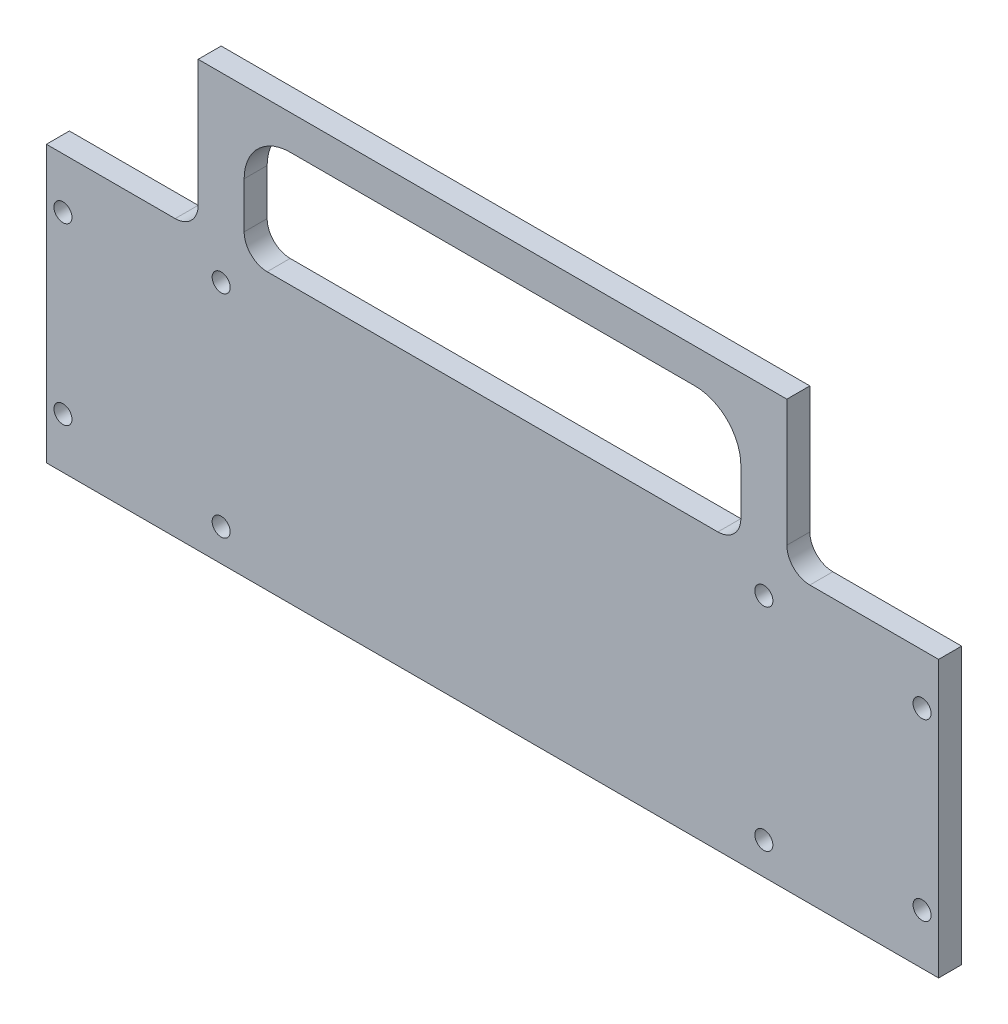
ISO-10303-21;
HEADER;
FILE_DESCRIPTION(('STEP AP214'),'2;1');
FILE_NAME('part.step','',(''),(''),'','','');
FILE_SCHEMA(('AUTOMOTIVE_DESIGN { 1 0 10303 214 1 1 1 1 }'));
ENDSEC;
DATA;
#1=APPLICATION_CONTEXT('core data for automotive mechanical design processes');
#2=APPLICATION_PROTOCOL_DEFINITION('international standard','automotive_design',2000,#1);
#3=PRODUCT_CONTEXT('',#1,'mechanical');
#4=PRODUCT('Part','Part','',(#3));
#5=PRODUCT_RELATED_PRODUCT_CATEGORY('part','',(#4));
#6=PRODUCT_DEFINITION_FORMATION('','',#4);
#7=PRODUCT_DEFINITION_CONTEXT('part definition',#1,'design');
#8=PRODUCT_DEFINITION('design','',#6,#7);
#9=PRODUCT_DEFINITION_SHAPE('','',#8);
#10=(LENGTH_UNIT() NAMED_UNIT(*) SI_UNIT(.MILLI.,.METRE.));
#11=(NAMED_UNIT(*) PLANE_ANGLE_UNIT() SI_UNIT($,.RADIAN.));
#12=(NAMED_UNIT(*) SI_UNIT($,.STERADIAN.) SOLID_ANGLE_UNIT());
#13=UNCERTAINTY_MEASURE_WITH_UNIT(LENGTH_MEASURE(1.E-05),#10,'distance_accuracy_value','');
#14=(GEOMETRIC_REPRESENTATION_CONTEXT(3) GLOBAL_UNCERTAINTY_ASSIGNED_CONTEXT((#13)) GLOBAL_UNIT_ASSIGNED_CONTEXT((#10,
#11,#12)) REPRESENTATION_CONTEXT('',''));
#15=CARTESIAN_POINT('',(0.,0.,0.));
#16=DIRECTION('',(0.,0.,1.));
#17=DIRECTION('',(1.,0.,0.));
#18=AXIS2_PLACEMENT_3D('',#15,#16,#17);
#19=CARTESIAN_POINT('',(-123.19,38.1,6.35));
#20=DIRECTION('',(0.,-1.,0.));
#21=DIRECTION('',(0.,0.,-1.));
#22=AXIS2_PLACEMENT_3D('',#19,#20,#21);
#23=PLANE('',#22);
#24=DIRECTION('',(-1.,0.,0.));
#25=VECTOR('',#24,1.);
#26=CARTESIAN_POINT('',(-123.19,38.1,6.35));
#27=LINE('',#26,#25);
#28=CARTESIAN_POINT('',(62.2299999999999,38.1,6.35));
#29=VERTEX_POINT('',#28);
#30=CARTESIAN_POINT('',(-62.23,38.1,6.35));
#31=VERTEX_POINT('',#30);
#32=EDGE_CURVE('E307',#29,#31,#27,.T.);
#33=ORIENTED_EDGE('',*,*,#32,.F.);
#34=DIRECTION('',(0.,0.,1.));
#35=VECTOR('',#34,1.);
#36=CARTESIAN_POINT('',(62.23,38.1,0.));
#37=LINE('',#36,#35);
#38=CARTESIAN_POINT('',(62.2299999999999,38.1,0.));
#39=VERTEX_POINT('',#38);
#40=EDGE_CURVE('E379',#29,#39,#37,.F.);
#41=ORIENTED_EDGE('',*,*,#40,.T.);
#42=DIRECTION('',(-1.,0.,0.));
#43=VECTOR('',#42,1.);
#44=CARTESIAN_POINT('',(-123.19,38.1,0.));
#45=LINE('',#44,#43);
#46=CARTESIAN_POINT('',(-62.23,38.1,0.));
#47=VERTEX_POINT('',#46);
#48=EDGE_CURVE('E323',#39,#47,#45,.T.);
#49=ORIENTED_EDGE('',*,*,#48,.T.);
#50=DIRECTION('',(0.,0.,1.));
#51=VECTOR('',#50,1.);
#52=CARTESIAN_POINT('',(-62.23,38.1,6.35));
#53=LINE('',#52,#51);
#54=EDGE_CURVE('E375',#47,#31,#53,.T.);
#55=ORIENTED_EDGE('',*,*,#54,.T.);
#56=EDGE_LOOP('',(#33,#41,#49,#55));
#57=FACE_BOUND('',#56,.T.);
#58=ADVANCED_FACE('F45',(#57),#23,.F.);
#59=CARTESIAN_POINT('',(-87.63,38.1,6.35));
#60=VERTEX_POINT('',#59);
#61=CARTESIAN_POINT('',(-123.19,38.1,6.35));
#62=VERTEX_POINT('',#61);
#63=EDGE_CURVE('E301',#60,#62,#27,.T.);
#64=ORIENTED_EDGE('',*,*,#63,.F.);
#65=DIRECTION('',(0.,0.,1.));
#66=VECTOR('',#65,1.);
#67=CARTESIAN_POINT('',(-87.63,38.1,0.));
#68=LINE('',#67,#66);
#69=CARTESIAN_POINT('',(-87.63,38.1,0.));
#70=VERTEX_POINT('',#69);
#71=EDGE_CURVE('E67',#60,#70,#68,.F.);
#72=ORIENTED_EDGE('',*,*,#71,.T.);
#73=CARTESIAN_POINT('',(-123.19,38.1,0.));
#74=VERTEX_POINT('',#73);
#75=EDGE_CURVE('E317',#70,#74,#45,.T.);
#76=ORIENTED_EDGE('',*,*,#75,.T.);
#77=DIRECTION('',(0.,0.,-1.));
#78=VECTOR('',#77,1.);
#79=CARTESIAN_POINT('',(-123.19,38.1,6.35));
#80=LINE('',#79,#78);
#81=EDGE_CURVE('E335',#62,#74,#80,.T.);
#82=ORIENTED_EDGE('',*,*,#81,.F.);
#83=EDGE_LOOP('',(#64,#72,#76,#82));
#84=FACE_BOUND('',#83,.T.);
#85=ADVANCED_FACE('F422',(#84),#23,.F.);
#86=CARTESIAN_POINT('',(123.19,38.1,6.35));
#87=DIRECTION('',(-1.,0.,0.));
#88=DIRECTION('',(0.,-1.,0.));
#89=AXIS2_PLACEMENT_3D('',#86,#87,#88);
#90=PLANE('',#89);
#91=DIRECTION('',(0.,1.,0.));
#92=VECTOR('',#91,1.);
#93=CARTESIAN_POINT('',(123.19,38.1,0.));
#94=LINE('',#93,#92);
#95=CARTESIAN_POINT('',(123.19,-38.1,0.));
#96=VERTEX_POINT('',#95);
#97=CARTESIAN_POINT('',(123.19,38.1,0.));
#98=VERTEX_POINT('',#97);
#99=EDGE_CURVE('E296',#96,#98,#94,.T.);
#100=ORIENTED_EDGE('',*,*,#99,.T.);
#101=DIRECTION('',(0.,0.,-1.));
#102=VECTOR('',#101,1.);
#103=CARTESIAN_POINT('',(123.19,38.1,6.35));
#104=LINE('',#103,#102);
#105=CARTESIAN_POINT('',(123.19,38.1,6.35));
#106=VERTEX_POINT('',#105);
#107=EDGE_CURVE('E339',#106,#98,#104,.T.);
#108=ORIENTED_EDGE('',*,*,#107,.F.);
#109=DIRECTION('',(0.,1.,0.));
#110=VECTOR('',#109,1.);
#111=CARTESIAN_POINT('',(123.19,38.1,6.35));
#112=LINE('',#111,#110);
#113=CARTESIAN_POINT('',(123.19,-38.1,6.35));
#114=VERTEX_POINT('',#113);
#115=EDGE_CURVE('E297',#114,#106,#112,.T.);
#116=ORIENTED_EDGE('',*,*,#115,.F.);
#117=DIRECTION('',(0.,0.,-1.));
#118=VECTOR('',#117,1.);
#119=CARTESIAN_POINT('',(123.19,-38.1,6.35));
#120=LINE('',#119,#118);
#121=EDGE_CURVE('E313',#114,#96,#120,.T.);
#122=ORIENTED_EDGE('',*,*,#121,.T.);
#123=EDGE_LOOP('',(#100,#108,#116,#122));
#124=FACE_BOUND('',#123,.T.);
#125=ADVANCED_FACE('F439',(#124),#90,.F.);
#126=CARTESIAN_POINT('',(87.6299999999999,38.1,0.));
#127=VERTEX_POINT('',#126);
#128=EDGE_CURVE('E318',#98,#127,#45,.T.);
#129=ORIENTED_EDGE('',*,*,#128,.T.);
#130=DIRECTION('',(0.,0.,1.));
#131=VECTOR('',#130,1.);
#132=CARTESIAN_POINT('',(87.63,38.1,6.35));
#133=LINE('',#132,#131);
#134=CARTESIAN_POINT('',(87.6299999999999,38.1,6.35));
#135=VERTEX_POINT('',#134);
#136=EDGE_CURVE('E397',#127,#135,#133,.T.);
#137=ORIENTED_EDGE('',*,*,#136,.T.);
#138=EDGE_CURVE('E303',#106,#135,#27,.T.);
#139=ORIENTED_EDGE('',*,*,#138,.F.);
#140=ORIENTED_EDGE('',*,*,#107,.T.);
#141=EDGE_LOOP('',(#129,#137,#139,#140));
#142=FACE_BOUND('',#141,.T.);
#143=ADVANCED_FACE('F462',(#142),#23,.F.);
#144=CARTESIAN_POINT('',(-123.19,38.1,6.35));
#145=DIRECTION('',(1.,0.,0.));
#146=DIRECTION('',(0.,1.,0.));
#147=AXIS2_PLACEMENT_3D('',#144,#145,#146);
#148=PLANE('',#147);
#149=DIRECTION('',(0.,-1.,0.));
#150=VECTOR('',#149,1.);
#151=CARTESIAN_POINT('',(-123.19,38.1,0.));
#152=LINE('',#151,#150);
#153=CARTESIAN_POINT('',(-123.19,-38.1,0.));
#154=VERTEX_POINT('',#153);
#155=EDGE_CURVE('E322',#74,#154,#152,.T.);
#156=ORIENTED_EDGE('',*,*,#155,.T.);
#157=DIRECTION('',(0.,0.,-1.));
#158=VECTOR('',#157,1.);
#159=CARTESIAN_POINT('',(-123.19,-38.1,6.35));
#160=LINE('',#159,#158);
#161=CARTESIAN_POINT('',(-123.19,-38.1,6.35));
#162=VERTEX_POINT('',#161);
#163=EDGE_CURVE('E331',#162,#154,#160,.T.);
#164=ORIENTED_EDGE('',*,*,#163,.F.);
#165=DIRECTION('',(0.,-1.,0.));
#166=VECTOR('',#165,1.);
#167=CARTESIAN_POINT('',(-123.19,38.1,6.35));
#168=LINE('',#167,#166);
#169=EDGE_CURVE('E306',#62,#162,#168,.T.);
#170=ORIENTED_EDGE('',*,*,#169,.F.);
#171=ORIENTED_EDGE('',*,*,#81,.T.);
#172=EDGE_LOOP('',(#156,#164,#170,#171));
#173=FACE_BOUND('',#172,.T.);
#174=ADVANCED_FACE('F428',(#173),#148,.F.);
#175=CARTESIAN_POINT('',(-123.19,-38.1,6.35));
#176=DIRECTION('',(0.,1.,0.));
#177=DIRECTION('',(0.,0.,1.));
#178=AXIS2_PLACEMENT_3D('',#175,#176,#177);
#179=PLANE('',#178);
#180=DIRECTION('',(1.,0.,0.));
#181=VECTOR('',#180,1.);
#182=CARTESIAN_POINT('',(-123.19,-38.1,0.));
#183=LINE('',#182,#181);
#184=EDGE_CURVE('E302',#154,#96,#183,.T.);
#185=ORIENTED_EDGE('',*,*,#184,.T.);
#186=ORIENTED_EDGE('',*,*,#121,.F.);
#187=DIRECTION('',(1.,0.,0.));
#188=VECTOR('',#187,1.);
#189=CARTESIAN_POINT('',(-123.19,-38.1,6.35));
#190=LINE('',#189,#188);
#191=EDGE_CURVE('E310',#162,#114,#190,.T.);
#192=ORIENTED_EDGE('',*,*,#191,.F.);
#193=ORIENTED_EDGE('',*,*,#163,.T.);
#194=EDGE_LOOP('',(#185,#186,#192,#193));
#195=FACE_BOUND('',#194,.T.);
#196=ADVANCED_FACE('F435',(#195),#179,.F.);
#197=CARTESIAN_POINT('',(0.,0.,6.35));
#198=DIRECTION('',(0.,0.,1.));
#199=DIRECTION('',(1.,0.,0.));
#200=AXIS2_PLACEMENT_3D('',#197,#198,#199);
#201=PLANE('',#200);
#202=ORIENTED_EDGE('',*,*,#138,.T.);
#203=CARTESIAN_POINT('',(87.63,44.45,6.35));
#204=DIRECTION('',(0.,0.,1.));
#205=DIRECTION('',(1.,0.,0.));
#206=AXIS2_PLACEMENT_3D('',#203,#204,#205);
#207=CIRCLE('',#206,6.35);
#208=CARTESIAN_POINT('',(81.28,44.45,6.35));
#209=VERTEX_POINT('',#208);
#210=EDGE_CURVE('E174',#135,#209,#207,.F.);
#211=ORIENTED_EDGE('',*,*,#210,.T.);
#212=DIRECTION('',(0.,1.,0.));
#213=VECTOR('',#212,1.);
#214=CARTESIAN_POINT('',(81.28,0.,6.35));
#215=LINE('',#214,#213);
#216=CARTESIAN_POINT('',(81.28,79.375,6.35));
#217=VERTEX_POINT('',#216);
#218=EDGE_CURVE('E168',#209,#217,#215,.T.);
#219=ORIENTED_EDGE('',*,*,#218,.T.);
#220=DIRECTION('',(1.,0.,0.));
#221=VECTOR('',#220,1.);
#222=CARTESIAN_POINT('',(0.,79.375,6.35));
#223=LINE('',#222,#221);
#224=CARTESIAN_POINT('',(-81.28,79.375,6.35));
#225=VERTEX_POINT('',#224);
#226=EDGE_CURVE('E173',#225,#217,#223,.T.);
#227=ORIENTED_EDGE('',*,*,#226,.F.);
#228=DIRECTION('',(0.,1.,0.));
#229=VECTOR('',#228,1.);
#230=CARTESIAN_POINT('',(-81.28,0.,6.35));
#231=LINE('',#230,#229);
#232=CARTESIAN_POINT('',(-81.28,44.45,6.35));
#233=VERTEX_POINT('',#232);
#234=EDGE_CURVE('E191',#233,#225,#231,.T.);
#235=ORIENTED_EDGE('',*,*,#234,.F.);
#236=CARTESIAN_POINT('',(-87.63,44.45,6.34999999999999));
#237=DIRECTION('',(0.,0.,1.));
#238=DIRECTION('',(1.,0.,0.));
#239=AXIS2_PLACEMENT_3D('',#236,#237,#238);
#240=CIRCLE('',#239,6.35);
#241=EDGE_CURVE('E54',#233,#60,#240,.F.);
#242=ORIENTED_EDGE('',*,*,#241,.T.);
#243=ORIENTED_EDGE('',*,*,#63,.T.);
#244=ORIENTED_EDGE('',*,*,#169,.T.);
#245=ORIENTED_EDGE('',*,*,#191,.T.);
#246=ORIENTED_EDGE('',*,*,#115,.T.);
#247=EDGE_LOOP('',(#202,#211,#219,#227,#235,#242,#243,#244,#245,#246));
#248=FACE_BOUND('',#247,.T.);
#249=CARTESIAN_POINT('',(-74.93,29.21,6.35));
#250=DIRECTION('',(0.,0.,1.));
#251=DIRECTION('',(1.,0.,0.));
#252=AXIS2_PLACEMENT_3D('',#249,#250,#251);
#253=CIRCLE('',#252,2.48919999999998);
#254=CARTESIAN_POINT('',(-72.4408,29.21,6.35));
#255=VERTEX_POINT('',#254);
#256=EDGE_CURVE('E232',#255,#255,#253,.T.);
#257=ORIENTED_EDGE('',*,*,#256,.F.);
#258=EDGE_LOOP('',(#257));
#259=FACE_BOUND('',#258,.T.);
#260=CARTESIAN_POINT('',(-74.93,-29.21,6.35));
#261=DIRECTION('',(0.,0.,1.));
#262=DIRECTION('',(1.,0.,0.));
#263=AXIS2_PLACEMENT_3D('',#260,#261,#262);
#264=CIRCLE('',#263,2.48919999999998);
#265=CARTESIAN_POINT('',(-72.4408,-29.21,6.35));
#266=VERTEX_POINT('',#265);
#267=EDGE_CURVE('E240',#266,#266,#264,.T.);
#268=ORIENTED_EDGE('',*,*,#267,.F.);
#269=EDGE_LOOP('',(#268));
#270=FACE_BOUND('',#269,.T.);
#271=CARTESIAN_POINT('',(74.93,29.21,6.35));
#272=DIRECTION('',(0.,0.,1.));
#273=DIRECTION('',(1.,0.,0.));
#274=AXIS2_PLACEMENT_3D('',#271,#272,#273);
#275=CIRCLE('',#274,2.48919999999998);
#276=CARTESIAN_POINT('',(77.4192,29.21,6.35));
#277=VERTEX_POINT('',#276);
#278=EDGE_CURVE('E248',#277,#277,#275,.T.);
#279=ORIENTED_EDGE('',*,*,#278,.F.);
#280=EDGE_LOOP('',(#279));
#281=FACE_BOUND('',#280,.T.);
#282=CARTESIAN_POINT('',(74.93,-29.21,6.35));
#283=DIRECTION('',(0.,0.,1.));
#284=DIRECTION('',(1.,0.,0.));
#285=AXIS2_PLACEMENT_3D('',#282,#283,#284);
#286=CIRCLE('',#285,2.48919999999998);
#287=CARTESIAN_POINT('',(77.4192,-29.21,6.35));
#288=VERTEX_POINT('',#287);
#289=EDGE_CURVE('E256',#288,#288,#286,.T.);
#290=ORIENTED_EDGE('',*,*,#289,.F.);
#291=EDGE_LOOP('',(#290));
#292=FACE_BOUND('',#291,.T.);
#293=CARTESIAN_POINT('',(-118.618,24.13,6.35));
#294=DIRECTION('',(0.,0.,1.));
#295=DIRECTION('',(1.,0.,0.));
#296=AXIS2_PLACEMENT_3D('',#293,#294,#295);
#297=CIRCLE('',#296,2.48919999999998);
#298=CARTESIAN_POINT('',(-116.1288,24.13,6.35));
#299=VERTEX_POINT('',#298);
#300=EDGE_CURVE('E264',#299,#299,#297,.T.);
#301=ORIENTED_EDGE('',*,*,#300,.F.);
#302=EDGE_LOOP('',(#301));
#303=FACE_BOUND('',#302,.T.);
#304=CARTESIAN_POINT('',(-118.618,-24.13,6.35));
#305=DIRECTION('',(0.,0.,1.));
#306=DIRECTION('',(1.,0.,0.));
#307=AXIS2_PLACEMENT_3D('',#304,#305,#306);
#308=CIRCLE('',#307,2.48919999999998);
#309=CARTESIAN_POINT('',(-116.1288,-24.13,6.35));
#310=VERTEX_POINT('',#309);
#311=EDGE_CURVE('E272',#310,#310,#308,.T.);
#312=ORIENTED_EDGE('',*,*,#311,.F.);
#313=EDGE_LOOP('',(#312));
#314=FACE_BOUND('',#313,.T.);
#315=CARTESIAN_POINT('',(118.618,24.13,6.35));
#316=DIRECTION('',(0.,0.,1.));
#317=DIRECTION('',(1.,0.,0.));
#318=AXIS2_PLACEMENT_3D('',#315,#316,#317);
#319=CIRCLE('',#318,2.48919999999998);
#320=CARTESIAN_POINT('',(121.1072,24.13,6.35));
#321=VERTEX_POINT('',#320);
#322=EDGE_CURVE('E280',#321,#321,#319,.T.);
#323=ORIENTED_EDGE('',*,*,#322,.F.);
#324=EDGE_LOOP('',(#323));
#325=FACE_BOUND('',#324,.T.);
#326=CARTESIAN_POINT('',(118.618,-24.13,6.35));
#327=DIRECTION('',(0.,0.,1.));
#328=DIRECTION('',(1.,0.,0.));
#329=AXIS2_PLACEMENT_3D('',#326,#327,#328);
#330=CIRCLE('',#329,2.48919999999998);
#331=CARTESIAN_POINT('',(121.1072,-24.13,6.35));
#332=VERTEX_POINT('',#331);
#333=EDGE_CURVE('E288',#332,#332,#330,.T.);
#334=ORIENTED_EDGE('',*,*,#333,.F.);
#335=EDGE_LOOP('',(#334));
#336=FACE_BOUND('',#335,.T.);
#337=DIRECTION('',(0.,1.,0.));
#338=VECTOR('',#337,1.);
#339=CARTESIAN_POINT('',(68.58,0.,6.35));
#340=LINE('',#339,#338);
#341=CARTESIAN_POINT('',(68.58,44.45,6.35));
#342=VERTEX_POINT('',#341);
#343=CARTESIAN_POINT('',(68.58,57.15,6.35));
#344=VERTEX_POINT('',#343);
#345=EDGE_CURVE('E179',#342,#344,#340,.T.);
#346=ORIENTED_EDGE('',*,*,#345,.F.);
#347=CARTESIAN_POINT('',(62.23,44.45,6.34999999999999));
#348=DIRECTION('',(0.,0.,1.));
#349=DIRECTION('',(1.,0.,0.));
#350=AXIS2_PLACEMENT_3D('',#347,#348,#349);
#351=CIRCLE('',#350,6.35);
#352=EDGE_CURVE('E385',#342,#29,#351,.F.);
#353=ORIENTED_EDGE('',*,*,#352,.T.);
#354=ORIENTED_EDGE('',*,*,#32,.T.);
#355=CARTESIAN_POINT('',(-62.23,44.45,6.35));
#356=DIRECTION('',(0.,0.,1.));
#357=DIRECTION('',(1.,0.,0.));
#358=AXIS2_PLACEMENT_3D('',#355,#356,#357);
#359=CIRCLE('',#358,6.35);
#360=CARTESIAN_POINT('',(-68.58,44.45,6.35));
#361=VERTEX_POINT('',#360);
#362=EDGE_CURVE('E391',#31,#361,#359,.F.);
#363=ORIENTED_EDGE('',*,*,#362,.T.);
#364=DIRECTION('',(0.,1.,0.));
#365=VECTOR('',#364,1.);
#366=CARTESIAN_POINT('',(-68.58,0.,6.35));
#367=LINE('',#366,#365);
#368=CARTESIAN_POINT('',(-68.58,57.15,6.35));
#369=VERTEX_POINT('',#368);
#370=EDGE_CURVE('E208',#361,#369,#367,.T.);
#371=ORIENTED_EDGE('',*,*,#370,.T.);
#372=CARTESIAN_POINT('',(-55.88,57.15,6.34999999999999));
#373=DIRECTION('',(0.,0.,1.));
#374=DIRECTION('',(1.,0.,0.));
#375=AXIS2_PLACEMENT_3D('',#372,#373,#374);
#376=CIRCLE('',#375,12.7);
#377=CARTESIAN_POINT('',(-55.88,69.85,6.35));
#378=VERTEX_POINT('',#377);
#379=EDGE_CURVE('E351',#369,#378,#376,.F.);
#380=ORIENTED_EDGE('',*,*,#379,.T.);
#381=DIRECTION('',(1.,0.,0.));
#382=VECTOR('',#381,1.);
#383=CARTESIAN_POINT('',(0.,69.85,6.35));
#384=LINE('',#383,#382);
#385=CARTESIAN_POINT('',(55.88,69.85,6.35));
#386=VERTEX_POINT('',#385);
#387=EDGE_CURVE('E192',#378,#386,#384,.T.);
#388=ORIENTED_EDGE('',*,*,#387,.T.);
#389=CARTESIAN_POINT('',(55.88,57.15,6.34999999999999));
#390=DIRECTION('',(0.,0.,1.));
#391=DIRECTION('',(1.,0.,0.));
#392=AXIS2_PLACEMENT_3D('',#389,#390,#391);
#393=CIRCLE('',#392,12.7);
#394=EDGE_CURVE('E364',#386,#344,#393,.F.);
#395=ORIENTED_EDGE('',*,*,#394,.T.);
#396=EDGE_LOOP('',(#346,#353,#354,#363,#371,#380,#388,#395));
#397=FACE_BOUND('',#396,.T.);
#398=ADVANCED_FACE('F171',(#248,#259,#270,#281,#292,#303,#314,#325,#336,#397),#201,.T.);
#399=CARTESIAN_POINT('',(0.,0.,0.));
#400=DIRECTION('',(0.,0.,1.));
#401=DIRECTION('',(1.,0.,0.));
#402=AXIS2_PLACEMENT_3D('',#399,#400,#401);
#403=PLANE('',#402);
#404=ORIENTED_EDGE('',*,*,#48,.F.);
#405=CARTESIAN_POINT('',(62.23,44.45,0.));
#406=DIRECTION('',(0.,0.,1.));
#407=DIRECTION('',(1.,0.,0.));
#408=AXIS2_PLACEMENT_3D('',#405,#406,#407);
#409=CIRCLE('',#408,6.35);
#410=CARTESIAN_POINT('',(68.58,44.45,0.));
#411=VERTEX_POINT('',#410);
#412=EDGE_CURVE('E388',#39,#411,#409,.T.);
#413=ORIENTED_EDGE('',*,*,#412,.T.);
#414=DIRECTION('',(0.,-1.,0.));
#415=VECTOR('',#414,1.);
#416=CARTESIAN_POINT('',(68.58,0.,0.));
#417=LINE('',#416,#415);
#418=CARTESIAN_POINT('',(68.58,57.15,0.));
#419=VERTEX_POINT('',#418);
#420=EDGE_CURVE('E198',#419,#411,#417,.T.);
#421=ORIENTED_EDGE('',*,*,#420,.F.);
#422=CARTESIAN_POINT('',(55.88,57.15,0.));
#423=DIRECTION('',(0.,0.,1.));
#424=DIRECTION('',(1.,0.,0.));
#425=AXIS2_PLACEMENT_3D('',#422,#423,#424);
#426=CIRCLE('',#425,12.7);
#427=CARTESIAN_POINT('',(55.88,69.85,0.));
#428=VERTEX_POINT('',#427);
#429=EDGE_CURVE('E368',#419,#428,#426,.T.);
#430=ORIENTED_EDGE('',*,*,#429,.T.);
#431=DIRECTION('',(-1.,0.,0.));
#432=VECTOR('',#431,1.);
#433=CARTESIAN_POINT('',(0.,69.85,0.));
#434=LINE('',#433,#432);
#435=CARTESIAN_POINT('',(-55.88,69.85,0.));
#436=VERTEX_POINT('',#435);
#437=EDGE_CURVE('E209',#428,#436,#434,.T.);
#438=ORIENTED_EDGE('',*,*,#437,.T.);
#439=CARTESIAN_POINT('',(-55.88,57.15,0.));
#440=DIRECTION('',(0.,0.,1.));
#441=DIRECTION('',(1.,0.,0.));
#442=AXIS2_PLACEMENT_3D('',#439,#440,#441);
#443=CIRCLE('',#442,12.7);
#444=CARTESIAN_POINT('',(-68.58,57.15,0.));
#445=VERTEX_POINT('',#444);
#446=EDGE_CURVE('E354',#436,#445,#443,.T.);
#447=ORIENTED_EDGE('',*,*,#446,.T.);
#448=DIRECTION('',(0.,-1.,0.));
#449=VECTOR('',#448,1.);
#450=CARTESIAN_POINT('',(-68.58,0.,0.));
#451=LINE('',#450,#449);
#452=CARTESIAN_POINT('',(-68.58,44.45,0.));
#453=VERTEX_POINT('',#452);
#454=EDGE_CURVE('E219',#445,#453,#451,.T.);
#455=ORIENTED_EDGE('',*,*,#454,.T.);
#456=CARTESIAN_POINT('',(-62.23,44.45,0.));
#457=DIRECTION('',(0.,0.,1.));
#458=DIRECTION('',(1.,0.,0.));
#459=AXIS2_PLACEMENT_3D('',#456,#457,#458);
#460=CIRCLE('',#459,6.35);
#461=EDGE_CURVE('E394',#453,#47,#460,.T.);
#462=ORIENTED_EDGE('',*,*,#461,.T.);
#463=EDGE_LOOP('',(#404,#413,#421,#430,#438,#447,#455,#462));
#464=FACE_BOUND('',#463,.T.);
#465=CARTESIAN_POINT('',(-74.93,29.21,0.));
#466=DIRECTION('',(0.,0.,1.));
#467=DIRECTION('',(1.,0.,0.));
#468=AXIS2_PLACEMENT_3D('',#465,#466,#467);
#469=CIRCLE('',#468,2.4892);
#470=CARTESIAN_POINT('',(-72.4408,29.21,0.));
#471=VERTEX_POINT('',#470);
#472=EDGE_CURVE('E236',#471,#471,#469,.T.);
#473=ORIENTED_EDGE('',*,*,#472,.T.);
#474=EDGE_LOOP('',(#473));
#475=FACE_BOUND('',#474,.T.);
#476=CARTESIAN_POINT('',(-74.93,-29.21,0.));
#477=DIRECTION('',(0.,0.,1.));
#478=DIRECTION('',(1.,0.,0.));
#479=AXIS2_PLACEMENT_3D('',#476,#477,#478);
#480=CIRCLE('',#479,2.4892);
#481=CARTESIAN_POINT('',(-72.4408,-29.21,0.));
#482=VERTEX_POINT('',#481);
#483=EDGE_CURVE('E244',#482,#482,#480,.T.);
#484=ORIENTED_EDGE('',*,*,#483,.T.);
#485=EDGE_LOOP('',(#484));
#486=FACE_BOUND('',#485,.T.);
#487=CARTESIAN_POINT('',(74.93,29.21,0.));
#488=DIRECTION('',(0.,0.,1.));
#489=DIRECTION('',(1.,0.,0.));
#490=AXIS2_PLACEMENT_3D('',#487,#488,#489);
#491=CIRCLE('',#490,2.4892);
#492=CARTESIAN_POINT('',(77.4192,29.21,0.));
#493=VERTEX_POINT('',#492);
#494=EDGE_CURVE('E252',#493,#493,#491,.T.);
#495=ORIENTED_EDGE('',*,*,#494,.T.);
#496=EDGE_LOOP('',(#495));
#497=FACE_BOUND('',#496,.T.);
#498=CARTESIAN_POINT('',(74.93,-29.21,0.));
#499=DIRECTION('',(0.,0.,1.));
#500=DIRECTION('',(1.,0.,0.));
#501=AXIS2_PLACEMENT_3D('',#498,#499,#500);
#502=CIRCLE('',#501,2.4892);
#503=CARTESIAN_POINT('',(77.4192,-29.21,0.));
#504=VERTEX_POINT('',#503);
#505=EDGE_CURVE('E260',#504,#504,#502,.T.);
#506=ORIENTED_EDGE('',*,*,#505,.T.);
#507=EDGE_LOOP('',(#506));
#508=FACE_BOUND('',#507,.T.);
#509=CARTESIAN_POINT('',(-118.618,24.13,0.));
#510=DIRECTION('',(0.,0.,1.));
#511=DIRECTION('',(1.,0.,0.));
#512=AXIS2_PLACEMENT_3D('',#509,#510,#511);
#513=CIRCLE('',#512,2.4892);
#514=CARTESIAN_POINT('',(-116.1288,24.13,0.));
#515=VERTEX_POINT('',#514);
#516=EDGE_CURVE('E268',#515,#515,#513,.T.);
#517=ORIENTED_EDGE('',*,*,#516,.T.);
#518=EDGE_LOOP('',(#517));
#519=FACE_BOUND('',#518,.T.);
#520=CARTESIAN_POINT('',(-118.618,-24.13,0.));
#521=DIRECTION('',(0.,0.,1.));
#522=DIRECTION('',(1.,0.,0.));
#523=AXIS2_PLACEMENT_3D('',#520,#521,#522);
#524=CIRCLE('',#523,2.4892);
#525=CARTESIAN_POINT('',(-116.1288,-24.13,0.));
#526=VERTEX_POINT('',#525);
#527=EDGE_CURVE('E276',#526,#526,#524,.T.);
#528=ORIENTED_EDGE('',*,*,#527,.T.);
#529=EDGE_LOOP('',(#528));
#530=FACE_BOUND('',#529,.T.);
#531=CARTESIAN_POINT('',(118.618,24.13,0.));
#532=DIRECTION('',(0.,0.,1.));
#533=DIRECTION('',(1.,0.,0.));
#534=AXIS2_PLACEMENT_3D('',#531,#532,#533);
#535=CIRCLE('',#534,2.4892);
#536=CARTESIAN_POINT('',(121.1072,24.13,0.));
#537=VERTEX_POINT('',#536);
#538=EDGE_CURVE('E284',#537,#537,#535,.T.);
#539=ORIENTED_EDGE('',*,*,#538,.T.);
#540=EDGE_LOOP('',(#539));
#541=FACE_BOUND('',#540,.T.);
#542=CARTESIAN_POINT('',(118.618,-24.13,0.));
#543=DIRECTION('',(0.,0.,1.));
#544=DIRECTION('',(1.,0.,0.));
#545=AXIS2_PLACEMENT_3D('',#542,#543,#544);
#546=CIRCLE('',#545,2.4892);
#547=CARTESIAN_POINT('',(121.1072,-24.13,0.));
#548=VERTEX_POINT('',#547);
#549=EDGE_CURVE('E292',#548,#548,#546,.T.);
#550=ORIENTED_EDGE('',*,*,#549,.T.);
#551=EDGE_LOOP('',(#550));
#552=FACE_BOUND('',#551,.T.);
#553=ORIENTED_EDGE('',*,*,#99,.F.);
#554=ORIENTED_EDGE('',*,*,#184,.F.);
#555=ORIENTED_EDGE('',*,*,#155,.F.);
#556=ORIENTED_EDGE('',*,*,#75,.F.);
#557=CARTESIAN_POINT('',(-87.63,44.45,0.));
#558=DIRECTION('',(0.,0.,1.));
#559=DIRECTION('',(1.,0.,0.));
#560=AXIS2_PLACEMENT_3D('',#557,#558,#559);
#561=CIRCLE('',#560,6.35);
#562=CARTESIAN_POINT('',(-81.28,44.45,0.));
#563=VERTEX_POINT('',#562);
#564=EDGE_CURVE('E11',#70,#563,#561,.T.);
#565=ORIENTED_EDGE('',*,*,#564,.T.);
#566=DIRECTION('',(0.,-1.,0.));
#567=VECTOR('',#566,1.);
#568=CARTESIAN_POINT('',(-81.28,0.,0.));
#569=LINE('',#568,#567);
#570=CARTESIAN_POINT('',(-81.28,79.375,0.));
#571=VERTEX_POINT('',#570);
#572=EDGE_CURVE('E215',#571,#563,#569,.T.);
#573=ORIENTED_EDGE('',*,*,#572,.F.);
#574=DIRECTION('',(-1.,0.,0.));
#575=VECTOR('',#574,1.);
#576=CARTESIAN_POINT('',(0.,79.375,0.));
#577=LINE('',#576,#575);
#578=CARTESIAN_POINT('',(81.28,79.375,0.));
#579=VERTEX_POINT('',#578);
#580=EDGE_CURVE('E212',#579,#571,#577,.T.);
#581=ORIENTED_EDGE('',*,*,#580,.F.);
#582=DIRECTION('',(0.,-1.,0.));
#583=VECTOR('',#582,1.);
#584=CARTESIAN_POINT('',(81.28,0.,0.));
#585=LINE('',#584,#583);
#586=CARTESIAN_POINT('',(81.28,44.45,0.));
#587=VERTEX_POINT('',#586);
#588=EDGE_CURVE('E196',#579,#587,#585,.T.);
#589=ORIENTED_EDGE('',*,*,#588,.T.);
#590=CARTESIAN_POINT('',(87.63,44.45,0.));
#591=DIRECTION('',(0.,0.,1.));
#592=DIRECTION('',(1.,0.,0.));
#593=AXIS2_PLACEMENT_3D('',#590,#591,#592);
#594=CIRCLE('',#593,6.35);
#595=EDGE_CURVE('E412',#587,#127,#594,.T.);
#596=ORIENTED_EDGE('',*,*,#595,.T.);
#597=ORIENTED_EDGE('',*,*,#128,.F.);
#598=EDGE_LOOP('',(#553,#554,#555,#556,#565,#573,#581,#589,#596,#597));
#599=FACE_BOUND('',#598,.T.);
#600=ADVANCED_FACE('F432',(#464,#475,#486,#497,#508,#519,#530,#541,#552,#599),#403,.F.);
#601=CARTESIAN_POINT('',(118.618,-24.13,6.35));
#602=DIRECTION('',(0.,0.,1.));
#603=DIRECTION('',(1.,0.,0.));
#604=AXIS2_PLACEMENT_3D('',#601,#602,#603);
#605=CYLINDRICAL_SURFACE('',#604,2.48919999999999);
#606=ORIENTED_EDGE('',*,*,#549,.F.);
#607=EDGE_LOOP('',(#606));
#608=FACE_BOUND('',#607,.T.);
#609=ORIENTED_EDGE('',*,*,#333,.T.);
#610=EDGE_LOOP('',(#609));
#611=FACE_BOUND('',#610,.T.);
#612=ADVANCED_FACE('F539',(#608,#611),#605,.F.);
#613=CARTESIAN_POINT('',(118.618,24.13,6.35));
#614=DIRECTION('',(0.,0.,1.));
#615=DIRECTION('',(1.,0.,0.));
#616=AXIS2_PLACEMENT_3D('',#613,#614,#615);
#617=CYLINDRICAL_SURFACE('',#616,2.48919999999999);
#618=ORIENTED_EDGE('',*,*,#538,.F.);
#619=EDGE_LOOP('',(#618));
#620=FACE_BOUND('',#619,.T.);
#621=ORIENTED_EDGE('',*,*,#322,.T.);
#622=EDGE_LOOP('',(#621));
#623=FACE_BOUND('',#622,.T.);
#624=ADVANCED_FACE('F546',(#620,#623),#617,.F.);
#625=CARTESIAN_POINT('',(-118.618,-24.13,6.35));
#626=DIRECTION('',(0.,0.,1.));
#627=DIRECTION('',(1.,0.,0.));
#628=AXIS2_PLACEMENT_3D('',#625,#626,#627);
#629=CYLINDRICAL_SURFACE('',#628,2.48919999999999);
#630=ORIENTED_EDGE('',*,*,#527,.F.);
#631=EDGE_LOOP('',(#630));
#632=FACE_BOUND('',#631,.T.);
#633=ORIENTED_EDGE('',*,*,#311,.T.);
#634=EDGE_LOOP('',(#633));
#635=FACE_BOUND('',#634,.T.);
#636=ADVANCED_FACE('F550',(#632,#635),#629,.F.);
#637=CARTESIAN_POINT('',(-118.618,24.13,6.35));
#638=DIRECTION('',(0.,0.,1.));
#639=DIRECTION('',(1.,0.,0.));
#640=AXIS2_PLACEMENT_3D('',#637,#638,#639);
#641=CYLINDRICAL_SURFACE('',#640,2.48919999999999);
#642=ORIENTED_EDGE('',*,*,#516,.F.);
#643=EDGE_LOOP('',(#642));
#644=FACE_BOUND('',#643,.T.);
#645=ORIENTED_EDGE('',*,*,#300,.T.);
#646=EDGE_LOOP('',(#645));
#647=FACE_BOUND('',#646,.T.);
#648=ADVANCED_FACE('F554',(#644,#647),#641,.F.);
#649=CARTESIAN_POINT('',(74.93,-29.21,6.35));
#650=DIRECTION('',(0.,0.,1.));
#651=DIRECTION('',(1.,0.,0.));
#652=AXIS2_PLACEMENT_3D('',#649,#650,#651);
#653=CYLINDRICAL_SURFACE('',#652,2.48919999999999);
#654=ORIENTED_EDGE('',*,*,#505,.F.);
#655=EDGE_LOOP('',(#654));
#656=FACE_BOUND('',#655,.T.);
#657=ORIENTED_EDGE('',*,*,#289,.T.);
#658=EDGE_LOOP('',(#657));
#659=FACE_BOUND('',#658,.T.);
#660=ADVANCED_FACE('F558',(#656,#659),#653,.F.);
#661=CARTESIAN_POINT('',(74.93,29.21,6.35));
#662=DIRECTION('',(0.,0.,1.));
#663=DIRECTION('',(1.,0.,0.));
#664=AXIS2_PLACEMENT_3D('',#661,#662,#663);
#665=CYLINDRICAL_SURFACE('',#664,2.48919999999999);
#666=ORIENTED_EDGE('',*,*,#494,.F.);
#667=EDGE_LOOP('',(#666));
#668=FACE_BOUND('',#667,.T.);
#669=ORIENTED_EDGE('',*,*,#278,.T.);
#670=EDGE_LOOP('',(#669));
#671=FACE_BOUND('',#670,.T.);
#672=ADVANCED_FACE('F562',(#668,#671),#665,.F.);
#673=CARTESIAN_POINT('',(-74.93,-29.21,6.35));
#674=DIRECTION('',(0.,0.,1.));
#675=DIRECTION('',(1.,0.,0.));
#676=AXIS2_PLACEMENT_3D('',#673,#674,#675);
#677=CYLINDRICAL_SURFACE('',#676,2.48919999999999);
#678=ORIENTED_EDGE('',*,*,#483,.F.);
#679=EDGE_LOOP('',(#678));
#680=FACE_BOUND('',#679,.T.);
#681=ORIENTED_EDGE('',*,*,#267,.T.);
#682=EDGE_LOOP('',(#681));
#683=FACE_BOUND('',#682,.T.);
#684=ADVANCED_FACE('F455',(#680,#683),#677,.F.);
#685=CARTESIAN_POINT('',(-74.93,29.21,6.35));
#686=DIRECTION('',(0.,0.,1.));
#687=DIRECTION('',(1.,0.,0.));
#688=AXIS2_PLACEMENT_3D('',#685,#686,#687);
#689=CYLINDRICAL_SURFACE('',#688,2.48919999999999);
#690=ORIENTED_EDGE('',*,*,#472,.F.);
#691=EDGE_LOOP('',(#690));
#692=FACE_BOUND('',#691,.T.);
#693=ORIENTED_EDGE('',*,*,#256,.T.);
#694=EDGE_LOOP('',(#693));
#695=FACE_BOUND('',#694,.T.);
#696=ADVANCED_FACE('F446',(#692,#695),#689,.F.);
#697=CARTESIAN_POINT('',(-81.28,0.,-91.1595525713021));
#698=DIRECTION('',(1.,0.,0.));
#699=DIRECTION('',(0.,1.,0.));
#700=AXIS2_PLACEMENT_3D('',#697,#698,#699);
#701=PLANE('',#700);
#702=ORIENTED_EDGE('',*,*,#572,.T.);
#703=DIRECTION('',(0.,0.,1.));
#704=VECTOR('',#703,1.);
#705=CARTESIAN_POINT('',(-81.28,44.45,6.34999999999999));
#706=LINE('',#705,#704);
#707=EDGE_CURVE('E404',#563,#233,#706,.T.);
#708=ORIENTED_EDGE('',*,*,#707,.T.);
#709=ORIENTED_EDGE('',*,*,#234,.T.);
#710=DIRECTION('',(0.,0.,1.));
#711=VECTOR('',#710,1.);
#712=CARTESIAN_POINT('',(-81.28,79.375,-91.1595525713021));
#713=LINE('',#712,#711);
#714=EDGE_CURVE('E189',#571,#225,#713,.T.);
#715=ORIENTED_EDGE('',*,*,#714,.F.);
#716=EDGE_LOOP('',(#702,#708,#709,#715));
#717=FACE_BOUND('',#716,.T.);
#718=ADVANCED_FACE('F444',(#717),#701,.F.);
#719=CARTESIAN_POINT('',(0.,79.375,-91.1595525713021));
#720=DIRECTION('',(0.,-1.,0.));
#721=DIRECTION('',(0.,0.,-1.));
#722=AXIS2_PLACEMENT_3D('',#719,#720,#721);
#723=PLANE('',#722);
#724=ORIENTED_EDGE('',*,*,#226,.T.);
#725=DIRECTION('',(0.,0.,1.));
#726=VECTOR('',#725,1.);
#727=CARTESIAN_POINT('',(81.28,79.375,-91.1595525713021));
#728=LINE('',#727,#726);
#729=EDGE_CURVE('E186',#579,#217,#728,.T.);
#730=ORIENTED_EDGE('',*,*,#729,.F.);
#731=ORIENTED_EDGE('',*,*,#580,.T.);
#732=ORIENTED_EDGE('',*,*,#714,.T.);
#733=EDGE_LOOP('',(#724,#730,#731,#732));
#734=FACE_BOUND('',#733,.T.);
#735=ADVANCED_FACE('F184',(#734),#723,.F.);
#736=CARTESIAN_POINT('',(0.,69.85,-91.1595525713021));
#737=DIRECTION('',(0.,-1.,0.));
#738=DIRECTION('',(0.,0.,-1.));
#739=AXIS2_PLACEMENT_3D('',#736,#737,#738);
#740=PLANE('',#739);
#741=ORIENTED_EDGE('',*,*,#437,.F.);
#742=DIRECTION('',(0.,0.,1.));
#743=VECTOR('',#742,1.);
#744=CARTESIAN_POINT('',(55.88,69.85,-91.1595525713021));
#745=LINE('',#744,#743);
#746=EDGE_CURVE('E357',#428,#386,#745,.T.);
#747=ORIENTED_EDGE('',*,*,#746,.T.);
#748=ORIENTED_EDGE('',*,*,#387,.F.);
#749=DIRECTION('',(0.,0.,1.));
#750=VECTOR('',#749,1.);
#751=CARTESIAN_POINT('',(-55.88,69.85,0.));
#752=LINE('',#751,#750);
#753=EDGE_CURVE('E347',#378,#436,#752,.F.);
#754=ORIENTED_EDGE('',*,*,#753,.T.);
#755=EDGE_LOOP('',(#741,#747,#748,#754));
#756=FACE_BOUND('',#755,.T.);
#757=ADVANCED_FACE('F452',(#756),#740,.T.);
#758=CARTESIAN_POINT('',(-68.58,0.,-91.1595525713021));
#759=DIRECTION('',(1.,0.,0.));
#760=DIRECTION('',(0.,1.,0.));
#761=AXIS2_PLACEMENT_3D('',#758,#759,#760);
#762=PLANE('',#761);
#763=ORIENTED_EDGE('',*,*,#370,.F.);
#764=DIRECTION('',(0.,0.,1.));
#765=VECTOR('',#764,1.);
#766=CARTESIAN_POINT('',(-68.58,44.45,-91.1595525713021));
#767=LINE('',#766,#765);
#768=EDGE_CURVE('E382',#361,#453,#767,.F.);
#769=ORIENTED_EDGE('',*,*,#768,.T.);
#770=ORIENTED_EDGE('',*,*,#454,.F.);
#771=DIRECTION('',(0.,0.,1.));
#772=VECTOR('',#771,1.);
#773=CARTESIAN_POINT('',(-68.58,57.15,6.34999999999999));
#774=LINE('',#773,#772);
#775=EDGE_CURVE('E343',#445,#369,#774,.T.);
#776=ORIENTED_EDGE('',*,*,#775,.T.);
#777=EDGE_LOOP('',(#763,#769,#770,#776));
#778=FACE_BOUND('',#777,.T.);
#779=ADVANCED_FACE('F502',(#778),#762,.T.);
#780=CARTESIAN_POINT('',(-55.88,57.15,-91.1595525713021));
#781=DIRECTION('',(0.,0.,-1.));
#782=DIRECTION('',(-1.,0.,0.));
#783=AXIS2_PLACEMENT_3D('',#780,#781,#782);
#784=CYLINDRICAL_SURFACE('',#783,12.7);
#785=ORIENTED_EDGE('',*,*,#446,.F.);
#786=ORIENTED_EDGE('',*,*,#753,.F.);
#787=ORIENTED_EDGE('',*,*,#379,.F.);
#788=ORIENTED_EDGE('',*,*,#775,.F.);
#789=EDGE_LOOP('',(#785,#786,#787,#788));
#790=FACE_BOUND('',#789,.T.);
#791=ADVANCED_FACE('F499',(#790),#784,.F.);
#792=CARTESIAN_POINT('',(68.58,0.,-91.1595525713021));
#793=DIRECTION('',(1.,0.,0.));
#794=DIRECTION('',(0.,1.,0.));
#795=AXIS2_PLACEMENT_3D('',#792,#793,#794);
#796=PLANE('',#795);
#797=ORIENTED_EDGE('',*,*,#420,.T.);
#798=DIRECTION('',(0.,0.,1.));
#799=VECTOR('',#798,1.);
#800=CARTESIAN_POINT('',(68.58,44.45,6.34999999999999));
#801=LINE('',#800,#799);
#802=EDGE_CURVE('E371',#411,#342,#801,.T.);
#803=ORIENTED_EDGE('',*,*,#802,.T.);
#804=ORIENTED_EDGE('',*,*,#345,.T.);
#805=DIRECTION('',(0.,0.,1.));
#806=VECTOR('',#805,1.);
#807=CARTESIAN_POINT('',(68.58,57.15,-91.1595525713021));
#808=LINE('',#807,#806);
#809=EDGE_CURVE('E361',#344,#419,#808,.F.);
#810=ORIENTED_EDGE('',*,*,#809,.T.);
#811=EDGE_LOOP('',(#797,#803,#804,#810));
#812=FACE_BOUND('',#811,.T.);
#813=ADVANCED_FACE('F501',(#812),#796,.F.);
#814=CARTESIAN_POINT('',(81.28,0.,-91.1595525713021));
#815=DIRECTION('',(1.,0.,0.));
#816=DIRECTION('',(0.,1.,0.));
#817=AXIS2_PLACEMENT_3D('',#814,#815,#816);
#818=PLANE('',#817);
#819=ORIENTED_EDGE('',*,*,#218,.F.);
#820=DIRECTION('',(0.,0.,1.));
#821=VECTOR('',#820,1.);
#822=CARTESIAN_POINT('',(81.28,44.45,-91.1595525713021));
#823=LINE('',#822,#821);
#824=EDGE_CURVE('E401',#209,#587,#823,.F.);
#825=ORIENTED_EDGE('',*,*,#824,.T.);
#826=ORIENTED_EDGE('',*,*,#588,.F.);
#827=ORIENTED_EDGE('',*,*,#729,.T.);
#828=EDGE_LOOP('',(#819,#825,#826,#827));
#829=FACE_BOUND('',#828,.T.);
#830=ADVANCED_FACE('F194',(#829),#818,.T.);
#831=CARTESIAN_POINT('',(55.88,57.15,-91.1595525713021));
#832=DIRECTION('',(0.,0.,1.));
#833=DIRECTION('',(1.,0.,0.));
#834=AXIS2_PLACEMENT_3D('',#831,#832,#833);
#835=CYLINDRICAL_SURFACE('',#834,12.7);
#836=ORIENTED_EDGE('',*,*,#429,.F.);
#837=ORIENTED_EDGE('',*,*,#809,.F.);
#838=ORIENTED_EDGE('',*,*,#394,.F.);
#839=ORIENTED_EDGE('',*,*,#746,.F.);
#840=EDGE_LOOP('',(#836,#837,#838,#839));
#841=FACE_BOUND('',#840,.T.);
#842=ADVANCED_FACE('F494',(#841),#835,.F.);
#843=CARTESIAN_POINT('',(62.23,44.45,-91.1595525713021));
#844=DIRECTION('',(0.,0.,-1.));
#845=DIRECTION('',(-1.,0.,0.));
#846=AXIS2_PLACEMENT_3D('',#843,#844,#845);
#847=CYLINDRICAL_SURFACE('',#846,6.35);
#848=ORIENTED_EDGE('',*,*,#412,.F.);
#849=ORIENTED_EDGE('',*,*,#40,.F.);
#850=ORIENTED_EDGE('',*,*,#352,.F.);
#851=ORIENTED_EDGE('',*,*,#802,.F.);
#852=EDGE_LOOP('',(#848,#849,#850,#851));
#853=FACE_BOUND('',#852,.T.);
#854=ADVANCED_FACE('F488',(#853),#847,.F.);
#855=CARTESIAN_POINT('',(-62.23,44.45,6.35));
#856=DIRECTION('',(0.,0.,1.));
#857=DIRECTION('',(1.,0.,0.));
#858=AXIS2_PLACEMENT_3D('',#855,#856,#857);
#859=CYLINDRICAL_SURFACE('',#858,6.35);
#860=ORIENTED_EDGE('',*,*,#461,.F.);
#861=ORIENTED_EDGE('',*,*,#768,.F.);
#862=ORIENTED_EDGE('',*,*,#362,.F.);
#863=ORIENTED_EDGE('',*,*,#54,.F.);
#864=EDGE_LOOP('',(#860,#861,#862,#863));
#865=FACE_BOUND('',#864,.T.);
#866=ADVANCED_FACE('F483',(#865),#859,.F.);
#867=CARTESIAN_POINT('',(87.63,44.45,6.35));
#868=DIRECTION('',(0.,0.,1.));
#869=DIRECTION('',(1.,0.,0.));
#870=AXIS2_PLACEMENT_3D('',#867,#868,#869);
#871=CYLINDRICAL_SURFACE('',#870,6.35);
#872=ORIENTED_EDGE('',*,*,#595,.F.);
#873=ORIENTED_EDGE('',*,*,#824,.F.);
#874=ORIENTED_EDGE('',*,*,#210,.F.);
#875=ORIENTED_EDGE('',*,*,#136,.F.);
#876=EDGE_LOOP('',(#872,#873,#874,#875));
#877=FACE_BOUND('',#876,.T.);
#878=ADVANCED_FACE('F481',(#877),#871,.F.);
#879=CARTESIAN_POINT('',(-87.63,44.45,-91.1595525713021));
#880=DIRECTION('',(0.,0.,-1.));
#881=DIRECTION('',(-1.,0.,0.));
#882=AXIS2_PLACEMENT_3D('',#879,#880,#881);
#883=CYLINDRICAL_SURFACE('',#882,6.35);
#884=ORIENTED_EDGE('',*,*,#564,.F.);
#885=ORIENTED_EDGE('',*,*,#71,.F.);
#886=ORIENTED_EDGE('',*,*,#241,.F.);
#887=ORIENTED_EDGE('',*,*,#707,.F.);
#888=EDGE_LOOP('',(#884,#885,#886,#887));
#889=FACE_BOUND('',#888,.T.);
#890=ADVANCED_FACE('F47',(#889),#883,.F.);
#891=CLOSED_SHELL('',(#58,#85,#125,#143,#174,#196,#398,#600,#612,#624,#636,#648,#660,#672,#684,
#696,#718,#735,#757,#779,#791,#813,#830,#842,#854,#866,#878,#890));
#892=MANIFOLD_SOLID_BREP('B2',#891);
#893=ADVANCED_BREP_SHAPE_REPRESENTATION('',(#18,#892),#14);
#894=SHAPE_DEFINITION_REPRESENTATION(#9,#893);
ENDSEC;
END-ISO-10303-21;
